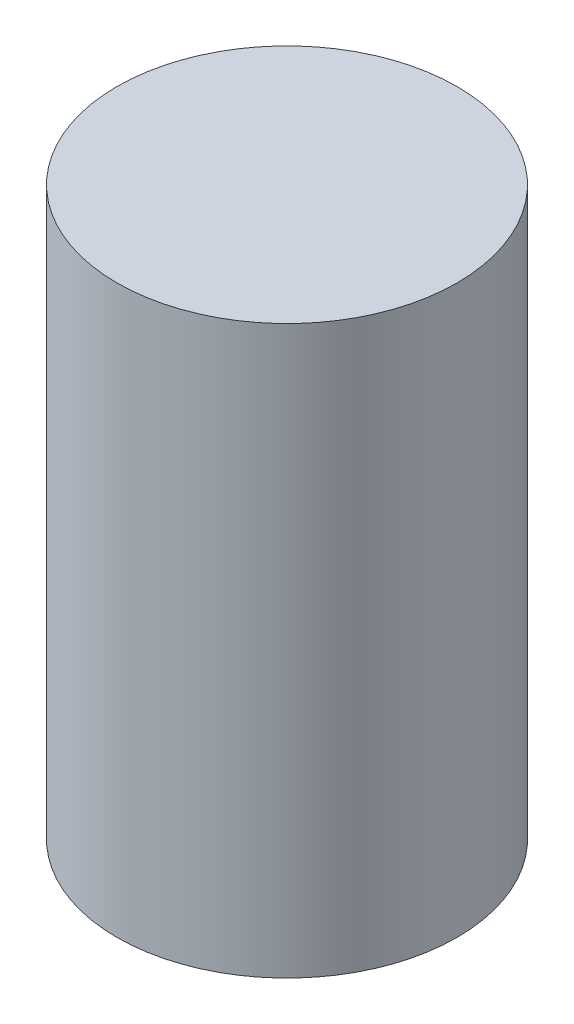
ISO-10303-21;
HEADER;
FILE_DESCRIPTION(('STEP AP214'),'2;1');
FILE_NAME('part.step','',(''),(''),'','','');
FILE_SCHEMA(('AUTOMOTIVE_DESIGN { 1 0 10303 214 1 1 1 1 }'));
ENDSEC;
DATA;
#1=APPLICATION_CONTEXT('core data for automotive mechanical design processes');
#2=APPLICATION_PROTOCOL_DEFINITION('international standard','automotive_design',2000,#1);
#3=PRODUCT_CONTEXT('',#1,'mechanical');
#4=PRODUCT('Part','Part','',(#3));
#5=PRODUCT_RELATED_PRODUCT_CATEGORY('part','',(#4));
#6=PRODUCT_DEFINITION_FORMATION('','',#4);
#7=PRODUCT_DEFINITION_CONTEXT('part definition',#1,'design');
#8=PRODUCT_DEFINITION('design','',#6,#7);
#9=PRODUCT_DEFINITION_SHAPE('','',#8);
#10=(LENGTH_UNIT() NAMED_UNIT(*) SI_UNIT(.MILLI.,.METRE.));
#11=(NAMED_UNIT(*) PLANE_ANGLE_UNIT() SI_UNIT($,.RADIAN.));
#12=(NAMED_UNIT(*) SI_UNIT($,.STERADIAN.) SOLID_ANGLE_UNIT());
#13=UNCERTAINTY_MEASURE_WITH_UNIT(LENGTH_MEASURE(1.E-05),#10,'distance_accuracy_value','');
#14=(GEOMETRIC_REPRESENTATION_CONTEXT(3) GLOBAL_UNCERTAINTY_ASSIGNED_CONTEXT((#13)) GLOBAL_UNIT_ASSIGNED_CONTEXT((#10,
#11,#12)) REPRESENTATION_CONTEXT('',''));
#15=CARTESIAN_POINT('',(0.,0.,0.));
#16=DIRECTION('',(0.,0.,1.));
#17=DIRECTION('',(1.,0.,0.));
#18=AXIS2_PLACEMENT_3D('',#15,#16,#17);
#19=CARTESIAN_POINT('',(0.,100.,0.));
#20=DIRECTION('',(0.,-1.,0.));
#21=DIRECTION('',(0.,0.,-1.));
#22=AXIS2_PLACEMENT_3D('',#19,#20,#21);
#23=CYLINDRICAL_SURFACE('',#22,30.);
#24=CARTESIAN_POINT('',(0.,100.,0.));
#25=DIRECTION('',(0.,1.,0.));
#26=DIRECTION('',(0.,0.,1.));
#27=AXIS2_PLACEMENT_3D('',#24,#25,#26);
#28=CIRCLE('',#27,30.);
#29=CARTESIAN_POINT('',(0.,100.,30.));
#30=VERTEX_POINT('',#29);
#31=EDGE_CURVE('E10',#30,#30,#28,.T.);
#32=ORIENTED_EDGE('',*,*,#31,.F.);
#33=EDGE_LOOP('',(#32));
#34=FACE_BOUND('',#33,.T.);
#35=CARTESIAN_POINT('',(0.,0.,0.));
#36=DIRECTION('',(0.,1.,0.));
#37=DIRECTION('',(0.,0.,1.));
#38=AXIS2_PLACEMENT_3D('',#35,#36,#37);
#39=CIRCLE('',#38,30.);
#40=CARTESIAN_POINT('',(0.,0.,30.));
#41=VERTEX_POINT('',#40);
#42=EDGE_CURVE('E46',#41,#41,#39,.T.);
#43=ORIENTED_EDGE('',*,*,#42,.T.);
#44=EDGE_LOOP('',(#43));
#45=FACE_BOUND('',#44,.T.);
#46=ADVANCED_FACE('F43',(#34,#45),#23,.T.);
#47=CARTESIAN_POINT('',(0.,100.,0.));
#48=DIRECTION('',(0.,1.,0.));
#49=DIRECTION('',(0.,0.,1.));
#50=AXIS2_PLACEMENT_3D('',#47,#48,#49);
#51=PLANE('',#50);
#52=ORIENTED_EDGE('',*,*,#31,.T.);
#53=EDGE_LOOP('',(#52));
#54=FACE_BOUND('',#53,.T.);
#55=ADVANCED_FACE('F87',(#54),#51,.T.);
#56=CARTESIAN_POINT('',(0.,0.,0.));
#57=DIRECTION('',(0.,1.,0.));
#58=DIRECTION('',(0.,0.,1.));
#59=AXIS2_PLACEMENT_3D('',#56,#57,#58);
#60=PLANE('',#59);
#61=CARTESIAN_POINT('',(0.,0.,-22.));
#62=DIRECTION('',(0.,-1.,0.));
#63=DIRECTION('',(0.,0.,-1.));
#64=AXIS2_PLACEMENT_3D('',#61,#62,#63);
#65=CIRCLE('',#64,5.);
#66=CARTESIAN_POINT('',(0.,0.,-27.));
#67=VERTEX_POINT('',#66);
#68=EDGE_CURVE('E69',#67,#67,#65,.T.);
#69=ORIENTED_EDGE('',*,*,#68,.F.);
#70=EDGE_LOOP('',(#69));
#71=FACE_BOUND('',#70,.T.);
#72=CARTESIAN_POINT('',(0.,0.,22.));
#73=DIRECTION('',(0.,-1.,0.));
#74=DIRECTION('',(0.,0.,-1.));
#75=AXIS2_PLACEMENT_3D('',#72,#73,#74);
#76=CIRCLE('',#75,5.);
#77=CARTESIAN_POINT('',(0.,0.,17.));
#78=VERTEX_POINT('',#77);
#79=EDGE_CURVE('E61',#78,#78,#76,.T.);
#80=ORIENTED_EDGE('',*,*,#79,.F.);
#81=EDGE_LOOP('',(#80));
#82=FACE_BOUND('',#81,.T.);
#83=CARTESIAN_POINT('',(0.,0.,0.));
#84=DIRECTION('',(0.,-1.,0.));
#85=DIRECTION('',(0.,0.,-1.));
#86=AXIS2_PLACEMENT_3D('',#83,#84,#85);
#87=CIRCLE('',#86,10.);
#88=CARTESIAN_POINT('',(0.,0.,-10.));
#89=VERTEX_POINT('',#88);
#90=EDGE_CURVE('E57',#89,#89,#87,.T.);
#91=ORIENTED_EDGE('',*,*,#90,.F.);
#92=EDGE_LOOP('',(#91));
#93=FACE_BOUND('',#92,.T.);
#94=ORIENTED_EDGE('',*,*,#42,.F.);
#95=EDGE_LOOP('',(#94));
#96=FACE_BOUND('',#95,.T.);
#97=ADVANCED_FACE('F83',(#71,#82,#93,#96),#60,.F.);
#98=CARTESIAN_POINT('',(0.,20.,0.));
#99=DIRECTION('',(0.,-1.,0.));
#100=DIRECTION('',(0.,0.,-1.));
#101=AXIS2_PLACEMENT_3D('',#98,#99,#100);
#102=CYLINDRICAL_SURFACE('',#101,10.);
#103=CARTESIAN_POINT('',(0.,20.,0.));
#104=DIRECTION('',(0.,-1.,0.));
#105=DIRECTION('',(0.,0.,-1.));
#106=AXIS2_PLACEMENT_3D('',#103,#104,#105);
#107=CIRCLE('',#106,10.);
#108=CARTESIAN_POINT('',(0.,20.,-10.));
#109=VERTEX_POINT('',#108);
#110=EDGE_CURVE('E55',#109,#109,#107,.T.);
#111=ORIENTED_EDGE('',*,*,#110,.F.);
#112=EDGE_LOOP('',(#111));
#113=FACE_BOUND('',#112,.T.);
#114=ORIENTED_EDGE('',*,*,#90,.T.);
#115=EDGE_LOOP('',(#114));
#116=FACE_BOUND('',#115,.T.);
#117=ADVANCED_FACE('F86',(#113,#116),#102,.F.);
#118=CARTESIAN_POINT('',(0.,20.,0.));
#119=DIRECTION('',(0.,-1.,0.));
#120=DIRECTION('',(0.,0.,-1.));
#121=AXIS2_PLACEMENT_3D('',#118,#119,#120);
#122=PLANE('',#121);
#123=ORIENTED_EDGE('',*,*,#110,.T.);
#124=EDGE_LOOP('',(#123));
#125=FACE_BOUND('',#124,.T.);
#126=ADVANCED_FACE('F104',(#125),#122,.T.);
#127=CARTESIAN_POINT('',(0.,20.,22.));
#128=DIRECTION('',(0.,-1.,0.));
#129=DIRECTION('',(0.,0.,-1.));
#130=AXIS2_PLACEMENT_3D('',#127,#128,#129);
#131=CYLINDRICAL_SURFACE('',#130,5.);
#132=CARTESIAN_POINT('',(0.,20.,22.));
#133=DIRECTION('',(0.,-1.,0.));
#134=DIRECTION('',(0.,0.,-1.));
#135=AXIS2_PLACEMENT_3D('',#132,#133,#134);
#136=CIRCLE('',#135,5.);
#137=CARTESIAN_POINT('',(0.,20.,17.));
#138=VERTEX_POINT('',#137);
#139=EDGE_CURVE('E73',#138,#138,#136,.T.);
#140=ORIENTED_EDGE('',*,*,#139,.F.);
#141=EDGE_LOOP('',(#140));
#142=FACE_BOUND('',#141,.T.);
#143=ORIENTED_EDGE('',*,*,#79,.T.);
#144=EDGE_LOOP('',(#143));
#145=FACE_BOUND('',#144,.T.);
#146=ADVANCED_FACE('F81',(#142,#145),#131,.F.);
#147=CARTESIAN_POINT('',(0.,20.,22.));
#148=DIRECTION('',(0.,-1.,0.));
#149=DIRECTION('',(0.,0.,-1.));
#150=AXIS2_PLACEMENT_3D('',#147,#148,#149);
#151=PLANE('',#150);
#152=ORIENTED_EDGE('',*,*,#139,.T.);
#153=EDGE_LOOP('',(#152));
#154=FACE_BOUND('',#153,.T.);
#155=ADVANCED_FACE('F116',(#154),#151,.T.);
#156=CARTESIAN_POINT('',(0.,20.,-22.));
#157=DIRECTION('',(0.,-1.,0.));
#158=DIRECTION('',(0.,0.,-1.));
#159=AXIS2_PLACEMENT_3D('',#156,#157,#158);
#160=CYLINDRICAL_SURFACE('',#159,5.);
#161=CARTESIAN_POINT('',(0.,20.,-22.));
#162=DIRECTION('',(0.,-1.,0.));
#163=DIRECTION('',(0.,0.,-1.));
#164=AXIS2_PLACEMENT_3D('',#161,#162,#163);
#165=CIRCLE('',#164,5.);
#166=CARTESIAN_POINT('',(0.,20.,-27.));
#167=VERTEX_POINT('',#166);
#168=EDGE_CURVE('E65',#167,#167,#165,.T.);
#169=ORIENTED_EDGE('',*,*,#168,.F.);
#170=EDGE_LOOP('',(#169));
#171=FACE_BOUND('',#170,.T.);
#172=ORIENTED_EDGE('',*,*,#68,.T.);
#173=EDGE_LOOP('',(#172));
#174=FACE_BOUND('',#173,.T.);
#175=ADVANCED_FACE('F112',(#171,#174),#160,.F.);
#176=CARTESIAN_POINT('',(0.,20.,-22.));
#177=DIRECTION('',(0.,-1.,0.));
#178=DIRECTION('',(0.,0.,-1.));
#179=AXIS2_PLACEMENT_3D('',#176,#177,#178);
#180=PLANE('',#179);
#181=ORIENTED_EDGE('',*,*,#168,.T.);
#182=EDGE_LOOP('',(#181));
#183=FACE_BOUND('',#182,.T.);
#184=ADVANCED_FACE('F109',(#183),#180,.T.);
#185=CLOSED_SHELL('',(#46,#55,#97,#117,#126,#146,#155,#175,#184));
#186=MANIFOLD_SOLID_BREP('B2',#185);
#187=ADVANCED_BREP_SHAPE_REPRESENTATION('',(#18,#186),#14);
#188=SHAPE_DEFINITION_REPRESENTATION(#9,#187);
ENDSEC;
END-ISO-10303-21;
